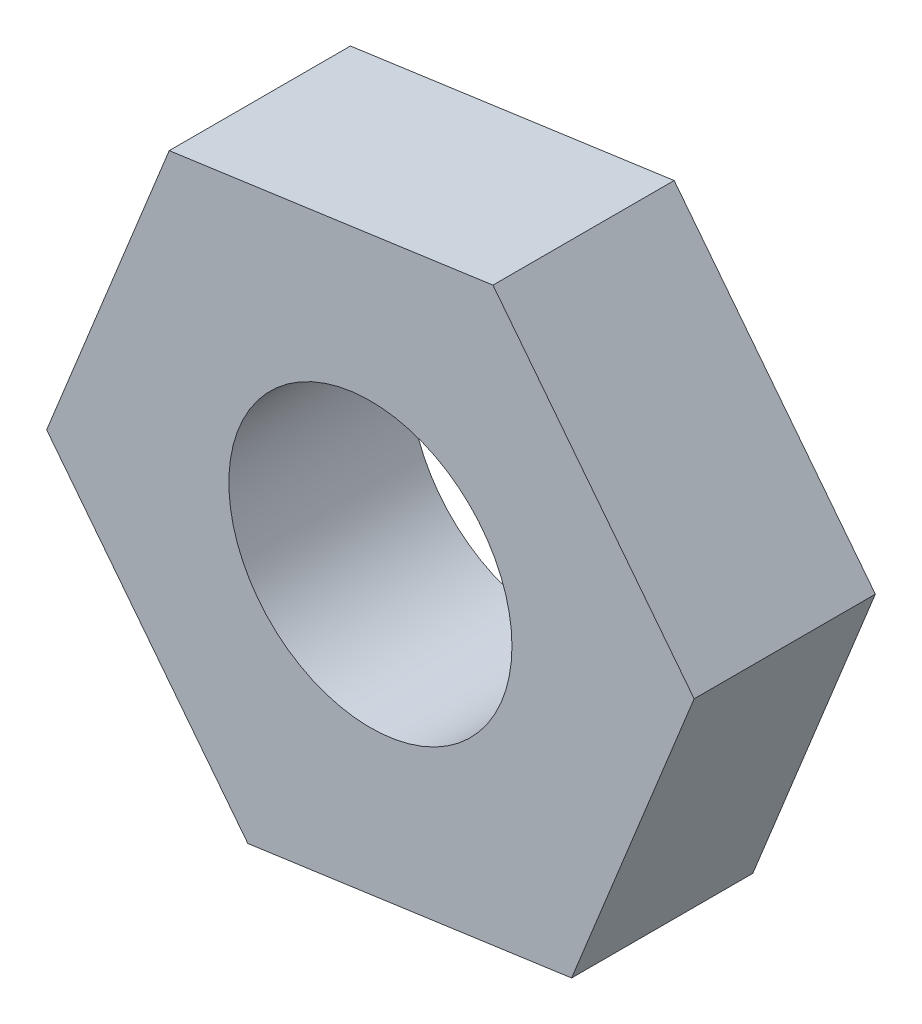
ISO-10303-21;
HEADER;
FILE_DESCRIPTION(('STEP AP214'),'2;1');
FILE_NAME('part.step','',(''),(''),'','','');
FILE_SCHEMA(('AUTOMOTIVE_DESIGN { 1 0 10303 214 1 1 1 1 }'));
ENDSEC;
DATA;
#1=APPLICATION_CONTEXT('core data for automotive mechanical design processes');
#2=APPLICATION_PROTOCOL_DEFINITION('international standard','automotive_design',2000,#1);
#3=PRODUCT_CONTEXT('',#1,'mechanical');
#4=PRODUCT('Part','Part','',(#3));
#5=PRODUCT_RELATED_PRODUCT_CATEGORY('part','',(#4));
#6=PRODUCT_DEFINITION_FORMATION('','',#4);
#7=PRODUCT_DEFINITION_CONTEXT('part definition',#1,'design');
#8=PRODUCT_DEFINITION('design','',#6,#7);
#9=PRODUCT_DEFINITION_SHAPE('','',#8);
#10=(LENGTH_UNIT() NAMED_UNIT(*) SI_UNIT(.MILLI.,.METRE.));
#11=(NAMED_UNIT(*) PLANE_ANGLE_UNIT() SI_UNIT($,.RADIAN.));
#12=(NAMED_UNIT(*) SI_UNIT($,.STERADIAN.) SOLID_ANGLE_UNIT());
#13=UNCERTAINTY_MEASURE_WITH_UNIT(LENGTH_MEASURE(1.E-05),#10,'distance_accuracy_value','');
#14=(GEOMETRIC_REPRESENTATION_CONTEXT(3) GLOBAL_UNCERTAINTY_ASSIGNED_CONTEXT((#13)) GLOBAL_UNIT_ASSIGNED_CONTEXT((#10,
#11,#12)) REPRESENTATION_CONTEXT('',''));
#15=CARTESIAN_POINT('',(0.,0.,0.));
#16=DIRECTION('',(0.,0.,1.));
#17=DIRECTION('',(1.,0.,0.));
#18=AXIS2_PLACEMENT_3D('',#15,#16,#17);
#19=CARTESIAN_POINT('',(0.,0.,2.032));
#20=DIRECTION('',(0.,0.,1.));
#21=DIRECTION('',(1.,0.,0.));
#22=AXIS2_PLACEMENT_3D('',#19,#20,#21);
#23=PLANE('',#22);
#24=DIRECTION('',(-0.374911944058099,-0.927060426403035,0.));
#25=VECTOR('',#24,1.);
#26=CARTESIAN_POINT('',(-2.25617060378733,2.88972793528029,2.032));
#27=LINE('',#26,#25);
#28=CARTESIAN_POINT('',(-2.25617060378733,2.88972793528029,2.032));
#29=VERTEX_POINT('',#28);
#30=CARTESIAN_POINT('',(-3.63066310387195,-0.509037090511359,2.032));
#31=VERTEX_POINT('',#30);
#32=EDGE_CURVE('E146',#29,#31,#27,.T.);
#33=ORIENTED_EDGE('',*,*,#32,.T.);
#34=DIRECTION('',(0.615401908079213,-0.788213480938041,0.));
#35=VECTOR('',#34,1.);
#36=CARTESIAN_POINT('',(-3.63066310387195,-0.509037090511359,2.032));
#37=LINE('',#36,#35);
#38=CARTESIAN_POINT('',(-1.37449250008461,-3.39876502579165,2.032));
#39=VERTEX_POINT('',#38);
#40=EDGE_CURVE('E94',#31,#39,#37,.T.);
#41=ORIENTED_EDGE('',*,*,#40,.T.);
#42=DIRECTION('',(0.990313852137312,0.138846945464994,0.));
#43=VECTOR('',#42,1.);
#44=CARTESIAN_POINT('',(-1.37449250008461,-3.39876502579165,2.032));
#45=LINE('',#44,#43);
#46=CARTESIAN_POINT('',(2.25617060378733,-2.88972793528029,2.032));
#47=VERTEX_POINT('',#46);
#48=EDGE_CURVE('E107',#39,#47,#45,.T.);
#49=ORIENTED_EDGE('',*,*,#48,.T.);
#50=DIRECTION('',(0.374911944058098,0.927060426403035,0.));
#51=VECTOR('',#50,1.);
#52=CARTESIAN_POINT('',(2.25617060378733,-2.88972793528029,2.032));
#53=LINE('',#52,#51);
#54=CARTESIAN_POINT('',(3.63066310387195,0.50903709051136,2.032));
#55=VERTEX_POINT('',#54);
#56=EDGE_CURVE('E101',#47,#55,#53,.T.);
#57=ORIENTED_EDGE('',*,*,#56,.T.);
#58=DIRECTION('',(-0.615401908079213,0.788213480938041,0.));
#59=VECTOR('',#58,1.);
#60=CARTESIAN_POINT('',(3.63066310387195,0.50903709051136,2.032));
#61=LINE('',#60,#59);
#62=CARTESIAN_POINT('',(1.37449250008462,3.39876502579164,2.032));
#63=VERTEX_POINT('',#62);
#64=EDGE_CURVE('E105',#55,#63,#61,.T.);
#65=ORIENTED_EDGE('',*,*,#64,.T.);
#66=DIRECTION('',(-0.990313852137312,-0.138846945464994,0.));
#67=VECTOR('',#66,1.);
#68=CARTESIAN_POINT('',(1.37449250008462,3.39876502579164,2.032));
#69=LINE('',#68,#67);
#70=EDGE_CURVE('E57',#63,#29,#69,.T.);
#71=ORIENTED_EDGE('',*,*,#70,.T.);
#72=EDGE_LOOP('',(#33,#41,#49,#57,#65,#71));
#73=FACE_BOUND('',#72,.T.);
#74=CARTESIAN_POINT('',(0.,0.,2.032));
#75=DIRECTION('',(0.,0.,1.));
#76=DIRECTION('',(1.,0.,0.));
#77=AXIS2_PLACEMENT_3D('',#74,#75,#76);
#78=CIRCLE('',#77,1.5875);
#79=CARTESIAN_POINT('',(1.5875,0.,2.032));
#80=VERTEX_POINT('',#79);
#81=EDGE_CURVE('E134',#80,#80,#78,.T.);
#82=ORIENTED_EDGE('',*,*,#81,.F.);
#83=EDGE_LOOP('',(#82));
#84=FACE_BOUND('',#83,.T.);
#85=ADVANCED_FACE('F39',(#73,#84),#23,.T.);
#86=CARTESIAN_POINT('',(0.,0.,0.));
#87=DIRECTION('',(0.,0.,1.));
#88=DIRECTION('',(1.,0.,0.));
#89=AXIS2_PLACEMENT_3D('',#86,#87,#88);
#90=PLANE('',#89);
#91=DIRECTION('',(-0.374911944058099,-0.927060426403035,0.));
#92=VECTOR('',#91,1.);
#93=CARTESIAN_POINT('',(-2.25617060378733,2.88972793528029,0.));
#94=LINE('',#93,#92);
#95=CARTESIAN_POINT('',(-2.25617060378733,2.88972793528029,0.));
#96=VERTEX_POINT('',#95);
#97=CARTESIAN_POINT('',(-3.63066310387195,-0.509037090511359,0.));
#98=VERTEX_POINT('',#97);
#99=EDGE_CURVE('E129',#96,#98,#94,.T.);
#100=ORIENTED_EDGE('',*,*,#99,.F.);
#101=DIRECTION('',(-0.990313852137312,-0.138846945464994,0.));
#102=VECTOR('',#101,1.);
#103=CARTESIAN_POINT('',(1.37449250008462,3.39876502579164,0.));
#104=LINE('',#103,#102);
#105=CARTESIAN_POINT('',(1.37449250008462,3.39876502579164,0.));
#106=VERTEX_POINT('',#105);
#107=EDGE_CURVE('E86',#106,#96,#104,.T.);
#108=ORIENTED_EDGE('',*,*,#107,.F.);
#109=DIRECTION('',(-0.615401908079213,0.788213480938041,0.));
#110=VECTOR('',#109,1.);
#111=CARTESIAN_POINT('',(3.63066310387195,0.50903709051136,0.));
#112=LINE('',#111,#110);
#113=CARTESIAN_POINT('',(3.63066310387195,0.50903709051136,0.));
#114=VERTEX_POINT('',#113);
#115=EDGE_CURVE('E80',#114,#106,#112,.T.);
#116=ORIENTED_EDGE('',*,*,#115,.F.);
#117=DIRECTION('',(0.374911944058098,0.927060426403035,0.));
#118=VECTOR('',#117,1.);
#119=CARTESIAN_POINT('',(2.25617060378733,-2.88972793528029,0.));
#120=LINE('',#119,#118);
#121=CARTESIAN_POINT('',(2.25617060378733,-2.88972793528029,0.));
#122=VERTEX_POINT('',#121);
#123=EDGE_CURVE('E116',#122,#114,#120,.T.);
#124=ORIENTED_EDGE('',*,*,#123,.F.);
#125=DIRECTION('',(0.990313852137312,0.138846945464994,0.));
#126=VECTOR('',#125,1.);
#127=CARTESIAN_POINT('',(-1.37449250008461,-3.39876502579165,0.));
#128=LINE('',#127,#126);
#129=CARTESIAN_POINT('',(-1.37449250008461,-3.39876502579165,0.));
#130=VERTEX_POINT('',#129);
#131=EDGE_CURVE('E137',#130,#122,#128,.T.);
#132=ORIENTED_EDGE('',*,*,#131,.F.);
#133=DIRECTION('',(0.615401908079213,-0.788213480938041,0.));
#134=VECTOR('',#133,1.);
#135=CARTESIAN_POINT('',(-3.63066310387195,-0.509037090511359,0.));
#136=LINE('',#135,#134);
#137=EDGE_CURVE('E133',#98,#130,#136,.T.);
#138=ORIENTED_EDGE('',*,*,#137,.F.);
#139=EDGE_LOOP('',(#100,#108,#116,#124,#132,#138));
#140=FACE_BOUND('',#139,.T.);
#141=CARTESIAN_POINT('',(0.,0.,0.));
#142=DIRECTION('',(0.,0.,1.));
#143=DIRECTION('',(1.,0.,0.));
#144=AXIS2_PLACEMENT_3D('',#141,#142,#143);
#145=CIRCLE('',#144,1.5875);
#146=CARTESIAN_POINT('',(1.5875,0.,0.));
#147=VERTEX_POINT('',#146);
#148=EDGE_CURVE('E243',#147,#147,#145,.T.);
#149=ORIENTED_EDGE('',*,*,#148,.T.);
#150=EDGE_LOOP('',(#149));
#151=FACE_BOUND('',#150,.T.);
#152=ADVANCED_FACE('F159',(#140,#151),#90,.F.);
#153=CARTESIAN_POINT('',(-2.25617060378733,2.88972793528029,2.032));
#154=DIRECTION('',(0.927060426403035,-0.374911944058099,0.));
#155=DIRECTION('',(0.374911944058099,0.927060426403035,0.));
#156=AXIS2_PLACEMENT_3D('',#153,#154,#155);
#157=PLANE('',#156);
#158=ORIENTED_EDGE('',*,*,#99,.T.);
#159=DIRECTION('',(0.,0.,-1.));
#160=VECTOR('',#159,1.);
#161=CARTESIAN_POINT('',(-3.63066310387195,-0.509037090511359,2.032));
#162=LINE('',#161,#160);
#163=EDGE_CURVE('E11',#31,#98,#162,.T.);
#164=ORIENTED_EDGE('',*,*,#163,.F.);
#165=ORIENTED_EDGE('',*,*,#32,.F.);
#166=DIRECTION('',(0.,0.,-1.));
#167=VECTOR('',#166,1.);
#168=CARTESIAN_POINT('',(-2.25617060378733,2.88972793528029,2.032));
#169=LINE('',#168,#167);
#170=EDGE_CURVE('E125',#29,#96,#169,.T.);
#171=ORIENTED_EDGE('',*,*,#170,.T.);
#172=EDGE_LOOP('',(#158,#164,#165,#171));
#173=FACE_BOUND('',#172,.T.);
#174=ADVANCED_FACE('F41',(#173),#157,.F.);
#175=CARTESIAN_POINT('',(-3.63066310387195,-0.509037090511359,2.032));
#176=DIRECTION('',(0.788213480938041,0.615401908079213,0.));
#177=DIRECTION('',(-0.615401908079213,0.788213480938041,0.));
#178=AXIS2_PLACEMENT_3D('',#175,#176,#177);
#179=PLANE('',#178);
#180=ORIENTED_EDGE('',*,*,#137,.T.);
#181=DIRECTION('',(0.,0.,-1.));
#182=VECTOR('',#181,1.);
#183=CARTESIAN_POINT('',(-1.37449250008461,-3.39876502579165,2.032));
#184=LINE('',#183,#182);
#185=EDGE_CURVE('E49',#39,#130,#184,.T.);
#186=ORIENTED_EDGE('',*,*,#185,.F.);
#187=ORIENTED_EDGE('',*,*,#40,.F.);
#188=ORIENTED_EDGE('',*,*,#163,.T.);
#189=EDGE_LOOP('',(#180,#186,#187,#188));
#190=FACE_BOUND('',#189,.T.);
#191=ADVANCED_FACE('F184',(#190),#179,.F.);
#192=CARTESIAN_POINT('',(-1.37449250008461,-3.39876502579165,2.032));
#193=DIRECTION('',(-0.138846945464994,0.990313852137312,0.));
#194=DIRECTION('',(-0.990313852137312,-0.138846945464994,0.));
#195=AXIS2_PLACEMENT_3D('',#192,#193,#194);
#196=PLANE('',#195);
#197=ORIENTED_EDGE('',*,*,#131,.T.);
#198=DIRECTION('',(0.,0.,-1.));
#199=VECTOR('',#198,1.);
#200=CARTESIAN_POINT('',(2.25617060378733,-2.88972793528029,2.032));
#201=LINE('',#200,#199);
#202=EDGE_CURVE('E118',#47,#122,#201,.T.);
#203=ORIENTED_EDGE('',*,*,#202,.F.);
#204=ORIENTED_EDGE('',*,*,#48,.F.);
#205=ORIENTED_EDGE('',*,*,#185,.T.);
#206=EDGE_LOOP('',(#197,#203,#204,#205));
#207=FACE_BOUND('',#206,.T.);
#208=ADVANCED_FACE('F156',(#207),#196,.F.);
#209=CARTESIAN_POINT('',(2.25617060378733,-2.88972793528029,2.032));
#210=DIRECTION('',(-0.927060426403035,0.374911944058098,0.));
#211=DIRECTION('',(-0.374911944058098,-0.927060426403035,0.));
#212=AXIS2_PLACEMENT_3D('',#209,#210,#211);
#213=PLANE('',#212);
#214=ORIENTED_EDGE('',*,*,#123,.T.);
#215=DIRECTION('',(0.,0.,-1.));
#216=VECTOR('',#215,1.);
#217=CARTESIAN_POINT('',(3.63066310387195,0.50903709051136,2.032));
#218=LINE('',#217,#216);
#219=EDGE_CURVE('E113',#55,#114,#218,.T.);
#220=ORIENTED_EDGE('',*,*,#219,.F.);
#221=ORIENTED_EDGE('',*,*,#56,.F.);
#222=ORIENTED_EDGE('',*,*,#202,.T.);
#223=EDGE_LOOP('',(#214,#220,#221,#222));
#224=FACE_BOUND('',#223,.T.);
#225=ADVANCED_FACE('F114',(#224),#213,.F.);
#226=CARTESIAN_POINT('',(3.63066310387195,0.50903709051136,2.032));
#227=DIRECTION('',(-0.788213480938041,-0.615401908079213,0.));
#228=DIRECTION('',(0.615401908079213,-0.788213480938041,0.));
#229=AXIS2_PLACEMENT_3D('',#226,#227,#228);
#230=PLANE('',#229);
#231=ORIENTED_EDGE('',*,*,#115,.T.);
#232=DIRECTION('',(0.,0.,-1.));
#233=VECTOR('',#232,1.);
#234=CARTESIAN_POINT('',(1.37449250008462,3.39876502579164,2.032));
#235=LINE('',#234,#233);
#236=EDGE_CURVE('E119',#63,#106,#235,.T.);
#237=ORIENTED_EDGE('',*,*,#236,.F.);
#238=ORIENTED_EDGE('',*,*,#64,.F.);
#239=ORIENTED_EDGE('',*,*,#219,.T.);
#240=EDGE_LOOP('',(#231,#237,#238,#239));
#241=FACE_BOUND('',#240,.T.);
#242=ADVANCED_FACE('F121',(#241),#230,.F.);
#243=CARTESIAN_POINT('',(1.37449250008462,3.39876502579164,2.032));
#244=DIRECTION('',(0.138846945464994,-0.990313852137312,0.));
#245=DIRECTION('',(0.990313852137312,0.138846945464994,0.));
#246=AXIS2_PLACEMENT_3D('',#243,#244,#245);
#247=PLANE('',#246);
#248=ORIENTED_EDGE('',*,*,#107,.T.);
#249=ORIENTED_EDGE('',*,*,#170,.F.);
#250=ORIENTED_EDGE('',*,*,#70,.F.);
#251=ORIENTED_EDGE('',*,*,#236,.T.);
#252=EDGE_LOOP('',(#248,#249,#250,#251));
#253=FACE_BOUND('',#252,.T.);
#254=ADVANCED_FACE('F164',(#253),#247,.F.);
#255=CARTESIAN_POINT('',(0.,0.,2.032));
#256=DIRECTION('',(0.,0.,-1.));
#257=DIRECTION('',(-1.,0.,0.));
#258=AXIS2_PLACEMENT_3D('',#255,#256,#257);
#259=CYLINDRICAL_SURFACE('',#258,1.5875);
#260=ORIENTED_EDGE('',*,*,#81,.T.);
#261=EDGE_LOOP('',(#260));
#262=FACE_BOUND('',#261,.T.);
#263=ORIENTED_EDGE('',*,*,#148,.F.);
#264=EDGE_LOOP('',(#263));
#265=FACE_BOUND('',#264,.T.);
#266=ADVANCED_FACE('F166',(#262,#265),#259,.F.);
#267=CLOSED_SHELL('',(#85,#152,#174,#191,#208,#225,#242,#254,#266));
#268=MANIFOLD_SOLID_BREP('B2',#267);
#269=ADVANCED_BREP_SHAPE_REPRESENTATION('',(#18,#268),#14);
#270=SHAPE_DEFINITION_REPRESENTATION(#9,#269);
ENDSEC;
END-ISO-10303-21;
